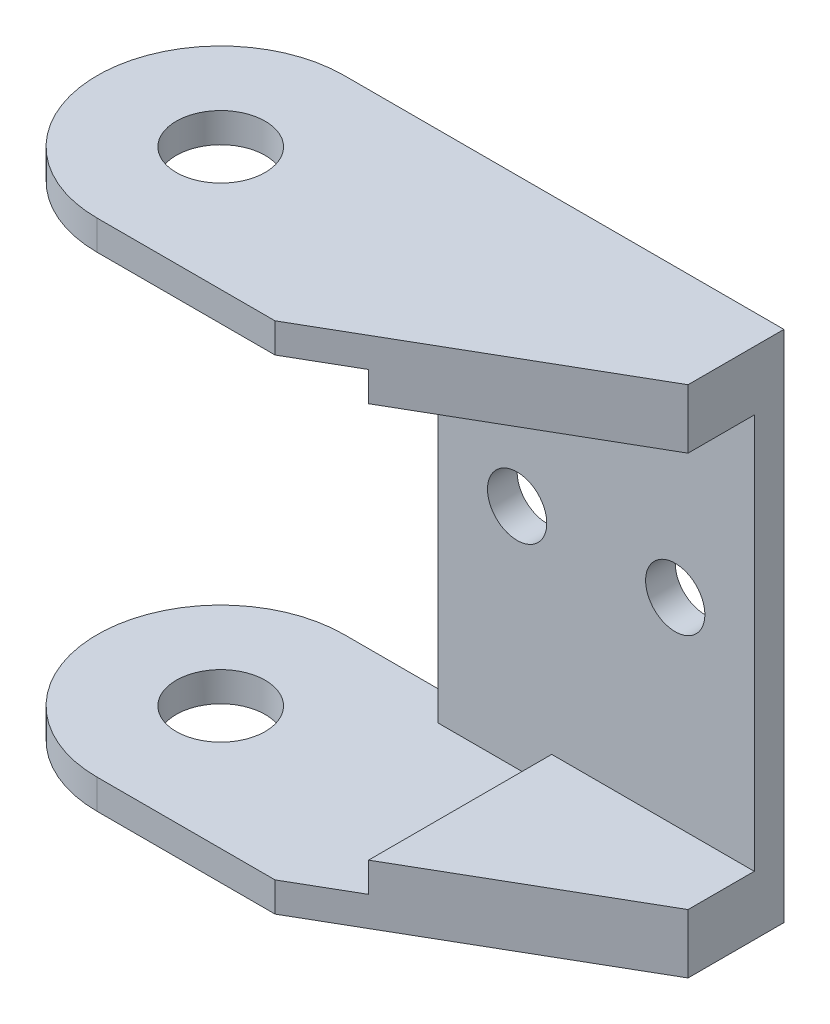
ISO-10303-21;
HEADER;
FILE_DESCRIPTION(('STEP AP214'),'2;1');
FILE_NAME('part.step','',(''),(''),'','','');
FILE_SCHEMA(('AUTOMOTIVE_DESIGN { 1 0 10303 214 1 1 1 1 }'));
ENDSEC;
DATA;
#1=APPLICATION_CONTEXT('core data for automotive mechanical design processes');
#2=APPLICATION_PROTOCOL_DEFINITION('international standard','automotive_design',2000,#1);
#3=PRODUCT_CONTEXT('',#1,'mechanical');
#4=PRODUCT('Part','Part','',(#3));
#5=PRODUCT_RELATED_PRODUCT_CATEGORY('part','',(#4));
#6=PRODUCT_DEFINITION_FORMATION('','',#4);
#7=PRODUCT_DEFINITION_CONTEXT('part definition',#1,'design');
#8=PRODUCT_DEFINITION('design','',#6,#7);
#9=PRODUCT_DEFINITION_SHAPE('','',#8);
#10=(LENGTH_UNIT() NAMED_UNIT(*) SI_UNIT(.MILLI.,.METRE.));
#11=(NAMED_UNIT(*) PLANE_ANGLE_UNIT() SI_UNIT($,.RADIAN.));
#12=(NAMED_UNIT(*) SI_UNIT($,.STERADIAN.) SOLID_ANGLE_UNIT());
#13=UNCERTAINTY_MEASURE_WITH_UNIT(LENGTH_MEASURE(1.E-05),#10,'distance_accuracy_value','');
#14=(GEOMETRIC_REPRESENTATION_CONTEXT(3) GLOBAL_UNCERTAINTY_ASSIGNED_CONTEXT((#13)) GLOBAL_UNIT_ASSIGNED_CONTEXT((#10,
#11,#12)) REPRESENTATION_CONTEXT('',''));
#15=CARTESIAN_POINT('',(0.,0.,0.));
#16=DIRECTION('',(0.,0.,1.));
#17=DIRECTION('',(1.,0.,0.));
#18=AXIS2_PLACEMENT_3D('',#15,#16,#17);
#19=CARTESIAN_POINT('',(0.,0.,0.));
#20=DIRECTION('',(0.,0.,-1.));
#21=DIRECTION('',(-1.,0.,0.));
#22=AXIS2_PLACEMENT_3D('',#19,#20,#21);
#23=PLANE('',#22);
#24=CARTESIAN_POINT('',(3.99999999999995,0.,0.));
#25=DIRECTION('',(0.,0.,-1.));
#26=DIRECTION('',(-1.,0.,0.));
#27=AXIS2_PLACEMENT_3D('',#24,#25,#26);
#28=CIRCLE('',#27,1.49999999999999);
#29=CARTESIAN_POINT('',(2.49999999999996,0.,0.));
#30=VERTEX_POINT('',#29);
#31=EDGE_CURVE('E282',#30,#30,#28,.T.);
#32=ORIENTED_EDGE('',*,*,#31,.F.);
#33=EDGE_LOOP('',(#32));
#34=FACE_BOUND('',#33,.T.);
#35=CARTESIAN_POINT('',(-4.00000000000006,0.,0.));
#36=DIRECTION('',(0.,0.,-1.));
#37=DIRECTION('',(-1.,0.,0.));
#38=AXIS2_PLACEMENT_3D('',#35,#36,#37);
#39=CIRCLE('',#38,1.49999999999999);
#40=CARTESIAN_POINT('',(-5.50000000000004,0.,0.));
#41=VERTEX_POINT('',#40);
#42=EDGE_CURVE('E272',#41,#41,#39,.T.);
#43=ORIENTED_EDGE('',*,*,#42,.F.);
#44=EDGE_LOOP('',(#43));
#45=FACE_BOUND('',#44,.T.);
#46=DIRECTION('',(-1.,0.,0.));
#47=VECTOR('',#46,1.);
#48=CARTESIAN_POINT('',(-7.99999999999995,-11.5,0.));
#49=LINE('',#48,#47);
#50=CARTESIAN_POINT('',(-7.99999999999995,-11.5,0.));
#51=VERTEX_POINT('',#50);
#52=CARTESIAN_POINT('',(-14.25,-11.5,0.));
#53=VERTEX_POINT('',#52);
#54=EDGE_CURVE('E162',#51,#53,#49,.T.);
#55=ORIENTED_EDGE('',*,*,#54,.F.);
#56=DIRECTION('',(0.,1.,0.));
#57=VECTOR('',#56,1.);
#58=CARTESIAN_POINT('',(-7.99999999999995,-9.99999999999997,0.));
#59=LINE('',#58,#57);
#60=CARTESIAN_POINT('',(-7.99999999999995,11.5,0.));
#61=VERTEX_POINT('',#60);
#62=EDGE_CURVE('E147',#51,#61,#59,.T.);
#63=ORIENTED_EDGE('',*,*,#62,.T.);
#64=DIRECTION('',(-1.,0.,0.));
#65=VECTOR('',#64,1.);
#66=CARTESIAN_POINT('',(-7.99999999999995,11.5,0.));
#67=LINE('',#66,#65);
#68=CARTESIAN_POINT('',(-14.25,11.5,0.));
#69=VERTEX_POINT('',#68);
#70=EDGE_CURVE('E199',#61,#69,#67,.T.);
#71=ORIENTED_EDGE('',*,*,#70,.T.);
#72=DIRECTION('',(0.,-1.,0.));
#73=VECTOR('',#72,1.);
#74=CARTESIAN_POINT('',(-14.25,13.,0.));
#75=LINE('',#74,#73);
#76=CARTESIAN_POINT('',(-14.25,13.,0.));
#77=VERTEX_POINT('',#76);
#78=EDGE_CURVE('E245',#77,#69,#75,.T.);
#79=ORIENTED_EDGE('',*,*,#78,.F.);
#80=DIRECTION('',(-1.,0.,0.));
#81=VECTOR('',#80,1.);
#82=CARTESIAN_POINT('',(-14.25,13.,0.));
#83=LINE('',#82,#81);
#84=CARTESIAN_POINT('',(7.99999999999995,13.,0.));
#85=VERTEX_POINT('',#84);
#86=EDGE_CURVE('E243',#85,#77,#83,.T.);
#87=ORIENTED_EDGE('',*,*,#86,.F.);
#88=DIRECTION('',(0.,-1.,0.));
#89=VECTOR('',#88,1.);
#90=CARTESIAN_POINT('',(7.99999999999995,9.99999999999998,0.));
#91=LINE('',#90,#89);
#92=CARTESIAN_POINT('',(7.99999999999995,-13.,0.));
#93=VERTEX_POINT('',#92);
#94=EDGE_CURVE('E157',#85,#93,#91,.T.);
#95=ORIENTED_EDGE('',*,*,#94,.T.);
#96=DIRECTION('',(-1.,0.,0.));
#97=VECTOR('',#96,1.);
#98=CARTESIAN_POINT('',(-14.25,-13.,0.));
#99=LINE('',#98,#97);
#100=CARTESIAN_POINT('',(-14.25,-13.,0.));
#101=VERTEX_POINT('',#100);
#102=EDGE_CURVE('E211',#93,#101,#99,.T.);
#103=ORIENTED_EDGE('',*,*,#102,.T.);
#104=DIRECTION('',(0.,1.,0.));
#105=VECTOR('',#104,1.);
#106=CARTESIAN_POINT('',(-14.25,-13.,0.));
#107=LINE('',#106,#105);
#108=EDGE_CURVE('E169',#101,#53,#107,.T.);
#109=ORIENTED_EDGE('',*,*,#108,.T.);
#110=EDGE_LOOP('',(#55,#63,#71,#79,#87,#95,#103,#109));
#111=FACE_BOUND('',#110,.T.);
#112=ADVANCED_FACE('F32',(#34,#45,#111),#23,.T.);
#113=CARTESIAN_POINT('',(-14.25,9.99999999999998,6.25));
#114=DIRECTION('',(0.,-1.,0.));
#115=DIRECTION('',(0.,0.,-1.));
#116=AXIS2_PLACEMENT_3D('',#113,#114,#115);
#117=PLANE('',#116);
#118=DIRECTION('',(0.86602540378444,0.,-0.499999999999998));
#119=VECTOR('',#118,1.);
#120=CARTESIAN_POINT('',(7.99999999999995,9.99999999999998,4.85010893323751));
#121=LINE('',#120,#119);
#122=CARTESIAN_POINT('',(-2.25000000000003,9.99999999999998,10.7679491924311));
#123=VERTEX_POINT('',#122);
#124=CARTESIAN_POINT('',(7.99999999999995,9.99999999999998,4.85010893323751));
#125=VERTEX_POINT('',#124);
#126=EDGE_CURVE('E246',#123,#125,#121,.T.);
#127=ORIENTED_EDGE('',*,*,#126,.F.);
#128=DIRECTION('',(0.,0.,-1.));
#129=VECTOR('',#128,1.);
#130=CARTESIAN_POINT('',(-2.25000000000003,9.99999999999998,12.5));
#131=LINE('',#130,#129);
#132=CARTESIAN_POINT('',(-2.25000000000003,9.99999999999998,1.5));
#133=VERTEX_POINT('',#132);
#134=EDGE_CURVE('E190',#123,#133,#131,.T.);
#135=ORIENTED_EDGE('',*,*,#134,.T.);
#136=DIRECTION('',(1.,0.,0.));
#137=VECTOR('',#136,1.);
#138=CARTESIAN_POINT('',(-7.99999999999995,9.99999999999998,1.5));
#139=LINE('',#138,#137);
#140=CARTESIAN_POINT('',(7.99999999999995,9.99999999999998,1.5));
#141=VERTEX_POINT('',#140);
#142=EDGE_CURVE('E258',#133,#141,#139,.T.);
#143=ORIENTED_EDGE('',*,*,#142,.T.);
#144=DIRECTION('',(0.,0.,-1.));
#145=VECTOR('',#144,1.);
#146=CARTESIAN_POINT('',(7.99999999999995,9.99999999999998,0.));
#147=LINE('',#146,#145);
#148=EDGE_CURVE('E236',#125,#141,#147,.T.);
#149=ORIENTED_EDGE('',*,*,#148,.F.);
#150=EDGE_LOOP('',(#127,#135,#143,#149));
#151=FACE_BOUND('',#150,.T.);
#152=ADVANCED_FACE('F309',(#151),#117,.T.);
#153=CARTESIAN_POINT('',(7.99999999999995,13.,4.85010893323751));
#154=DIRECTION('',(-0.499999999999998,0.,-0.86602540378444));
#155=DIRECTION('',(-0.86602540378444,0.,0.499999999999998));
#156=AXIS2_PLACEMENT_3D('',#153,#154,#155);
#157=PLANE('',#156);
#158=DIRECTION('',(0.,1.,0.));
#159=VECTOR('',#158,1.);
#160=CARTESIAN_POINT('',(-2.25000000000003,13.,10.7679491924311));
#161=LINE('',#160,#159);
#162=CARTESIAN_POINT('',(-2.25000000000003,11.5,10.7679491924311));
#163=VERTEX_POINT('',#162);
#164=EDGE_CURVE('E41',#123,#163,#161,.T.);
#165=ORIENTED_EDGE('',*,*,#164,.F.);
#166=ORIENTED_EDGE('',*,*,#126,.T.);
#167=DIRECTION('',(0.,-1.,0.));
#168=VECTOR('',#167,1.);
#169=CARTESIAN_POINT('',(7.99999999999995,13.,4.85010893323751));
#170=LINE('',#169,#168);
#171=CARTESIAN_POINT('',(7.99999999999995,13.,4.85010893323751));
#172=VERTEX_POINT('',#171);
#173=EDGE_CURVE('E345',#172,#125,#170,.T.);
#174=ORIENTED_EDGE('',*,*,#173,.F.);
#175=DIRECTION('',(0.86602540378444,0.,-0.499999999999998));
#176=VECTOR('',#175,1.);
#177=CARTESIAN_POINT('',(7.99999999999995,13.,4.85010893323751));
#178=LINE('',#177,#176);
#179=CARTESIAN_POINT('',(-5.25000000000003,13.,12.5));
#180=VERTEX_POINT('',#179);
#181=EDGE_CURVE('E238',#180,#172,#178,.T.);
#182=ORIENTED_EDGE('',*,*,#181,.F.);
#183=DIRECTION('',(0.,-1.,0.));
#184=VECTOR('',#183,1.);
#185=CARTESIAN_POINT('',(-5.25000000000003,13.,12.5));
#186=LINE('',#185,#184);
#187=CARTESIAN_POINT('',(-5.25000000000004,11.5,12.5));
#188=VERTEX_POINT('',#187);
#189=EDGE_CURVE('E351',#180,#188,#186,.T.);
#190=ORIENTED_EDGE('',*,*,#189,.T.);
#191=DIRECTION('',(0.86602540378444,0.,-0.499999999999998));
#192=VECTOR('',#191,1.);
#193=CARTESIAN_POINT('',(7.99999999999995,11.5,4.85010893323751));
#194=LINE('',#193,#192);
#195=EDGE_CURVE('E367',#188,#163,#194,.T.);
#196=ORIENTED_EDGE('',*,*,#195,.T.);
#197=EDGE_LOOP('',(#165,#166,#174,#182,#190,#196));
#198=FACE_BOUND('',#197,.T.);
#199=ADVANCED_FACE('F315',(#198),#157,.F.);
#200=CARTESIAN_POINT('',(-7.99999999999995,-9.99999999999997,1.5));
#201=DIRECTION('',(-1.,0.,0.));
#202=DIRECTION('',(0.,0.,1.));
#203=AXIS2_PLACEMENT_3D('',#200,#201,#202);
#204=PLANE('',#203);
#205=ORIENTED_EDGE('',*,*,#62,.F.);
#206=DIRECTION('',(0.,0.,-1.));
#207=VECTOR('',#206,1.);
#208=CARTESIAN_POINT('',(-7.99999999999995,-11.5,1.5));
#209=LINE('',#208,#207);
#210=CARTESIAN_POINT('',(-7.99999999999995,-11.5,1.5));
#211=VERTEX_POINT('',#210);
#212=EDGE_CURVE('E149',#211,#51,#209,.T.);
#213=ORIENTED_EDGE('',*,*,#212,.F.);
#214=DIRECTION('',(0.,1.,0.));
#215=VECTOR('',#214,1.);
#216=CARTESIAN_POINT('',(-7.99999999999995,-9.99999999999997,1.5));
#217=LINE('',#216,#215);
#218=CARTESIAN_POINT('',(-7.99999999999995,11.5,1.5));
#219=VERTEX_POINT('',#218);
#220=EDGE_CURVE('E256',#211,#219,#217,.T.);
#221=ORIENTED_EDGE('',*,*,#220,.T.);
#222=DIRECTION('',(0.,0.,-1.));
#223=VECTOR('',#222,1.);
#224=CARTESIAN_POINT('',(-7.99999999999995,11.5,1.5));
#225=LINE('',#224,#223);
#226=EDGE_CURVE('E152',#219,#61,#225,.T.);
#227=ORIENTED_EDGE('',*,*,#226,.T.);
#228=EDGE_LOOP('',(#205,#213,#221,#227));
#229=FACE_BOUND('',#228,.T.);
#230=ADVANCED_FACE('F34',(#229),#204,.T.);
#231=CARTESIAN_POINT('',(7.99999999999995,9.99999999999998,1.5));
#232=DIRECTION('',(1.,0.,0.));
#233=DIRECTION('',(0.,0.,-1.));
#234=AXIS2_PLACEMENT_3D('',#231,#232,#233);
#235=PLANE('',#234);
#236=ORIENTED_EDGE('',*,*,#94,.F.);
#237=DIRECTION('',(0.,0.,-1.));
#238=VECTOR('',#237,1.);
#239=CARTESIAN_POINT('',(7.99999999999995,13.,0.));
#240=LINE('',#239,#238);
#241=EDGE_CURVE('E240',#172,#85,#240,.T.);
#242=ORIENTED_EDGE('',*,*,#241,.F.);
#243=ORIENTED_EDGE('',*,*,#173,.T.);
#244=ORIENTED_EDGE('',*,*,#148,.T.);
#245=DIRECTION('',(0.,-1.,0.));
#246=VECTOR('',#245,1.);
#247=CARTESIAN_POINT('',(7.99999999999995,9.99999999999998,1.5));
#248=LINE('',#247,#246);
#249=CARTESIAN_POINT('',(7.99999999999995,-9.99999999999998,1.5));
#250=VERTEX_POINT('',#249);
#251=EDGE_CURVE('E264',#141,#250,#248,.T.);
#252=ORIENTED_EDGE('',*,*,#251,.T.);
#253=DIRECTION('',(0.,0.,-1.));
#254=VECTOR('',#253,1.);
#255=CARTESIAN_POINT('',(7.99999999999995,-9.99999999999998,0.));
#256=LINE('',#255,#254);
#257=CARTESIAN_POINT('',(7.99999999999995,-9.99999999999998,4.85010893323751));
#258=VERTEX_POINT('',#257);
#259=EDGE_CURVE('E207',#258,#250,#256,.T.);
#260=ORIENTED_EDGE('',*,*,#259,.F.);
#261=DIRECTION('',(0.,1.,0.));
#262=VECTOR('',#261,1.);
#263=CARTESIAN_POINT('',(7.99999999999995,-13.,4.85010893323751));
#264=LINE('',#263,#262);
#265=CARTESIAN_POINT('',(7.99999999999995,-13.,4.85010893323751));
#266=VERTEX_POINT('',#265);
#267=EDGE_CURVE('E579',#266,#258,#264,.T.);
#268=ORIENTED_EDGE('',*,*,#267,.F.);
#269=DIRECTION('',(0.,0.,-1.));
#270=VECTOR('',#269,1.);
#271=CARTESIAN_POINT('',(7.99999999999995,-13.,0.));
#272=LINE('',#271,#270);
#273=EDGE_CURVE('E214',#266,#93,#272,.T.);
#274=ORIENTED_EDGE('',*,*,#273,.T.);
#275=EDGE_LOOP('',(#236,#242,#243,#244,#252,#260,#268,#274));
#276=FACE_BOUND('',#275,.T.);
#277=ADVANCED_FACE('F323',(#276),#235,.T.);
#278=CARTESIAN_POINT('',(0.,0.,1.5));
#279=DIRECTION('',(0.,0.,-1.));
#280=DIRECTION('',(-1.,0.,0.));
#281=AXIS2_PLACEMENT_3D('',#278,#279,#280);
#282=PLANE('',#281);
#283=CARTESIAN_POINT('',(3.99999999999995,0.,1.5));
#284=DIRECTION('',(0.,0.,-1.));
#285=DIRECTION('',(-1.,0.,0.));
#286=AXIS2_PLACEMENT_3D('',#283,#284,#285);
#287=CIRCLE('',#286,1.49999999999999);
#288=CARTESIAN_POINT('',(2.49999999999996,0.,1.5));
#289=VERTEX_POINT('',#288);
#290=EDGE_CURVE('E36',#289,#289,#287,.T.);
#291=ORIENTED_EDGE('',*,*,#290,.T.);
#292=EDGE_LOOP('',(#291));
#293=FACE_BOUND('',#292,.T.);
#294=CARTESIAN_POINT('',(-4.00000000000006,0.,1.5));
#295=DIRECTION('',(0.,0.,-1.));
#296=DIRECTION('',(-1.,0.,0.));
#297=AXIS2_PLACEMENT_3D('',#294,#295,#296);
#298=CIRCLE('',#297,1.49999999999999);
#299=CARTESIAN_POINT('',(-5.50000000000004,0.,1.5));
#300=VERTEX_POINT('',#299);
#301=EDGE_CURVE('E269',#300,#300,#298,.T.);
#302=ORIENTED_EDGE('',*,*,#301,.T.);
#303=EDGE_LOOP('',(#302));
#304=FACE_BOUND('',#303,.T.);
#305=ORIENTED_EDGE('',*,*,#220,.F.);
#306=DIRECTION('',(-1.,0.,0.));
#307=VECTOR('',#306,1.);
#308=CARTESIAN_POINT('',(-2.25000000000003,-11.5,1.5));
#309=LINE('',#308,#307);
#310=CARTESIAN_POINT('',(-2.25000000000003,-11.5,1.5));
#311=VERTEX_POINT('',#310);
#312=EDGE_CURVE('E165',#311,#211,#309,.T.);
#313=ORIENTED_EDGE('',*,*,#312,.F.);
#314=DIRECTION('',(0.,1.,0.));
#315=VECTOR('',#314,1.);
#316=CARTESIAN_POINT('',(-2.25000000000003,-11.5,1.5));
#317=LINE('',#316,#315);
#318=CARTESIAN_POINT('',(-2.25000000000003,-9.99999999999998,1.5));
#319=VERTEX_POINT('',#318);
#320=EDGE_CURVE('E182',#311,#319,#317,.T.);
#321=ORIENTED_EDGE('',*,*,#320,.T.);
#322=DIRECTION('',(-1.,0.,0.));
#323=VECTOR('',#322,1.);
#324=CARTESIAN_POINT('',(7.99999999999995,-9.99999999999998,1.5));
#325=LINE('',#324,#323);
#326=EDGE_CURVE('E365',#250,#319,#325,.T.);
#327=ORIENTED_EDGE('',*,*,#326,.F.);
#328=ORIENTED_EDGE('',*,*,#251,.F.);
#329=ORIENTED_EDGE('',*,*,#142,.F.);
#330=DIRECTION('',(0.,-1.,0.));
#331=VECTOR('',#330,1.);
#332=CARTESIAN_POINT('',(-2.25000000000003,11.5,1.5));
#333=LINE('',#332,#331);
#334=CARTESIAN_POINT('',(-2.25000000000003,11.5,1.5));
#335=VERTEX_POINT('',#334);
#336=EDGE_CURVE('E201',#335,#133,#333,.T.);
#337=ORIENTED_EDGE('',*,*,#336,.F.);
#338=DIRECTION('',(-1.,0.,0.));
#339=VECTOR('',#338,1.);
#340=CARTESIAN_POINT('',(-2.25000000000003,11.5,1.5));
#341=LINE('',#340,#339);
#342=EDGE_CURVE('E195',#335,#219,#341,.T.);
#343=ORIENTED_EDGE('',*,*,#342,.T.);
#344=EDGE_LOOP('',(#305,#313,#321,#327,#328,#329,#337,#343));
#345=FACE_BOUND('',#344,.T.);
#346=ADVANCED_FACE('F321',(#293,#304,#345),#282,.F.);
#347=CARTESIAN_POINT('',(-14.25,13.,6.25));
#348=DIRECTION('',(0.,-1.,0.));
#349=DIRECTION('',(0.,0.,-1.));
#350=AXIS2_PLACEMENT_3D('',#347,#348,#349);
#351=CYLINDRICAL_SURFACE('',#350,6.25);
#352=ORIENTED_EDGE('',*,*,#78,.T.);
#353=CARTESIAN_POINT('',(-14.25,11.5,6.25));
#354=DIRECTION('',(0.,1.,0.));
#355=DIRECTION('',(0.,0.,1.));
#356=AXIS2_PLACEMENT_3D('',#353,#354,#355);
#357=CIRCLE('',#356,6.25);
#358=CARTESIAN_POINT('',(-14.25,11.5,12.5));
#359=VERTEX_POINT('',#358);
#360=EDGE_CURVE('E205',#69,#359,#357,.T.);
#361=ORIENTED_EDGE('',*,*,#360,.T.);
#362=DIRECTION('',(0.,-1.,0.));
#363=VECTOR('',#362,1.);
#364=CARTESIAN_POINT('',(-14.25,13.,12.5));
#365=LINE('',#364,#363);
#366=CARTESIAN_POINT('',(-14.25,13.,12.5));
#367=VERTEX_POINT('',#366);
#368=EDGE_CURVE('E158',#367,#359,#365,.T.);
#369=ORIENTED_EDGE('',*,*,#368,.F.);
#370=CARTESIAN_POINT('',(-14.25,13.,6.25));
#371=DIRECTION('',(0.,1.,0.));
#372=DIRECTION('',(0.,0.,-1.));
#373=AXIS2_PLACEMENT_3D('',#370,#371,#372);
#374=CIRCLE('',#373,6.25);
#375=EDGE_CURVE('E232',#77,#367,#374,.T.);
#376=ORIENTED_EDGE('',*,*,#375,.F.);
#377=EDGE_LOOP('',(#352,#361,#369,#376));
#378=FACE_BOUND('',#377,.T.);
#379=ADVANCED_FACE('F330',(#378),#351,.T.);
#380=CARTESIAN_POINT('',(-5.25000000000003,13.,12.5));
#381=DIRECTION('',(0.,0.,-1.));
#382=DIRECTION('',(-1.,0.,0.));
#383=AXIS2_PLACEMENT_3D('',#380,#381,#382);
#384=PLANE('',#383);
#385=ORIENTED_EDGE('',*,*,#368,.T.);
#386=DIRECTION('',(1.,0.,0.));
#387=VECTOR('',#386,1.);
#388=CARTESIAN_POINT('',(-20.5,11.5,12.5));
#389=LINE('',#388,#387);
#390=EDGE_CURVE('E191',#359,#188,#389,.T.);
#391=ORIENTED_EDGE('',*,*,#390,.T.);
#392=ORIENTED_EDGE('',*,*,#189,.F.);
#393=DIRECTION('',(1.,0.,0.));
#394=VECTOR('',#393,1.);
#395=CARTESIAN_POINT('',(-5.25000000000003,13.,12.5));
#396=LINE('',#395,#394);
#397=EDGE_CURVE('E235',#367,#180,#396,.T.);
#398=ORIENTED_EDGE('',*,*,#397,.F.);
#399=EDGE_LOOP('',(#385,#391,#392,#398));
#400=FACE_BOUND('',#399,.T.);
#401=ADVANCED_FACE('F352',(#400),#384,.F.);
#402=CARTESIAN_POINT('',(-14.25,13.,6.25));
#403=DIRECTION('',(0.,-1.,0.));
#404=DIRECTION('',(0.,0.,-1.));
#405=AXIS2_PLACEMENT_3D('',#402,#403,#404);
#406=PLANE('',#405);
#407=CARTESIAN_POINT('',(-14.25,13.,6.25));
#408=DIRECTION('',(0.,1.,0.));
#409=DIRECTION('',(0.,0.,1.));
#410=AXIS2_PLACEMENT_3D('',#407,#408,#409);
#411=CIRCLE('',#410,2.24999999999999);
#412=CARTESIAN_POINT('',(-14.25,13.,8.49999999999999));
#413=VERTEX_POINT('',#412);
#414=EDGE_CURVE('E271',#413,#413,#411,.T.);
#415=ORIENTED_EDGE('',*,*,#414,.F.);
#416=EDGE_LOOP('',(#415));
#417=FACE_BOUND('',#416,.T.);
#418=ORIENTED_EDGE('',*,*,#375,.T.);
#419=ORIENTED_EDGE('',*,*,#397,.T.);
#420=ORIENTED_EDGE('',*,*,#181,.T.);
#421=ORIENTED_EDGE('',*,*,#241,.T.);
#422=ORIENTED_EDGE('',*,*,#86,.T.);
#423=EDGE_LOOP('',(#418,#419,#420,#421,#422));
#424=FACE_BOUND('',#423,.T.);
#425=ADVANCED_FACE('F338',(#417,#424),#406,.F.);
#426=CARTESIAN_POINT('',(-14.25,-13.,6.25));
#427=DIRECTION('',(0.,1.,0.));
#428=DIRECTION('',(0.,0.,1.));
#429=AXIS2_PLACEMENT_3D('',#426,#427,#428);
#430=CYLINDRICAL_SURFACE('',#429,6.25);
#431=CARTESIAN_POINT('',(-14.25,-11.5,6.25));
#432=DIRECTION('',(0.,-1.,0.));
#433=DIRECTION('',(0.,0.,-1.));
#434=AXIS2_PLACEMENT_3D('',#431,#432,#433);
#435=CIRCLE('',#434,6.25);
#436=CARTESIAN_POINT('',(-14.25,-11.5,12.5));
#437=VERTEX_POINT('',#436);
#438=EDGE_CURVE('E188',#53,#437,#435,.F.);
#439=ORIENTED_EDGE('',*,*,#438,.F.);
#440=ORIENTED_EDGE('',*,*,#108,.F.);
#441=CARTESIAN_POINT('',(-14.25,-13.,6.25));
#442=DIRECTION('',(0.,1.,0.));
#443=DIRECTION('',(0.,0.,-1.));
#444=AXIS2_PLACEMENT_3D('',#441,#442,#443);
#445=CIRCLE('',#444,6.25);
#446=CARTESIAN_POINT('',(-14.25,-13.,12.5));
#447=VERTEX_POINT('',#446);
#448=EDGE_CURVE('E208',#101,#447,#445,.T.);
#449=ORIENTED_EDGE('',*,*,#448,.T.);
#450=DIRECTION('',(0.,1.,0.));
#451=VECTOR('',#450,1.);
#452=CARTESIAN_POINT('',(-14.25,-13.,12.5));
#453=LINE('',#452,#451);
#454=EDGE_CURVE('E223',#447,#437,#453,.T.);
#455=ORIENTED_EDGE('',*,*,#454,.T.);
#456=EDGE_LOOP('',(#439,#440,#449,#455));
#457=FACE_BOUND('',#456,.T.);
#458=ADVANCED_FACE('F398',(#457),#430,.T.);
#459=CARTESIAN_POINT('',(7.99999999999995,-13.,4.85010893323751));
#460=DIRECTION('',(0.499999999999998,0.,0.86602540378444));
#461=DIRECTION('',(0.86602540378444,0.,-0.499999999999998));
#462=AXIS2_PLACEMENT_3D('',#459,#460,#461);
#463=PLANE('',#462);
#464=DIRECTION('',(0.,1.,0.));
#465=VECTOR('',#464,1.);
#466=CARTESIAN_POINT('',(-2.25000000000003,-13.,10.7679491924311));
#467=LINE('',#466,#465);
#468=CARTESIAN_POINT('',(-2.25000000000003,-11.5,10.7679491924311));
#469=VERTEX_POINT('',#468);
#470=CARTESIAN_POINT('',(-2.25000000000003,-9.99999999999998,10.7679491924311));
#471=VERTEX_POINT('',#470);
#472=EDGE_CURVE('E48',#469,#471,#467,.T.);
#473=ORIENTED_EDGE('',*,*,#472,.F.);
#474=DIRECTION('',(0.86602540378444,0.,-0.499999999999998));
#475=VECTOR('',#474,1.);
#476=CARTESIAN_POINT('',(7.99999999999995,-11.5,4.85010893323751));
#477=LINE('',#476,#475);
#478=CARTESIAN_POINT('',(-5.25000000000003,-11.5,12.5));
#479=VERTEX_POINT('',#478);
#480=EDGE_CURVE('E186',#479,#469,#477,.T.);
#481=ORIENTED_EDGE('',*,*,#480,.F.);
#482=DIRECTION('',(0.,1.,0.));
#483=VECTOR('',#482,1.);
#484=CARTESIAN_POINT('',(-5.25000000000003,-13.,12.5));
#485=LINE('',#484,#483);
#486=CARTESIAN_POINT('',(-5.25000000000003,-13.,12.5));
#487=VERTEX_POINT('',#486);
#488=EDGE_CURVE('E576',#487,#479,#485,.T.);
#489=ORIENTED_EDGE('',*,*,#488,.F.);
#490=DIRECTION('',(0.86602540378444,0.,-0.499999999999998));
#491=VECTOR('',#490,1.);
#492=CARTESIAN_POINT('',(7.99999999999995,-13.,4.85010893323751));
#493=LINE('',#492,#491);
#494=EDGE_CURVE('E217',#487,#266,#493,.T.);
#495=ORIENTED_EDGE('',*,*,#494,.T.);
#496=ORIENTED_EDGE('',*,*,#267,.T.);
#497=DIRECTION('',(0.86602540378444,0.,-0.499999999999998));
#498=VECTOR('',#497,1.);
#499=CARTESIAN_POINT('',(7.99999999999995,-9.99999999999998,4.85010893323751));
#500=LINE('',#499,#498);
#501=EDGE_CURVE('E212',#471,#258,#500,.T.);
#502=ORIENTED_EDGE('',*,*,#501,.F.);
#503=EDGE_LOOP('',(#473,#481,#489,#495,#496,#502));
#504=FACE_BOUND('',#503,.T.);
#505=ADVANCED_FACE('F394',(#504),#463,.T.);
#506=CARTESIAN_POINT('',(-5.25000000000003,-13.,12.5));
#507=DIRECTION('',(0.,0.,1.));
#508=DIRECTION('',(1.,0.,0.));
#509=AXIS2_PLACEMENT_3D('',#506,#507,#508);
#510=PLANE('',#509);
#511=DIRECTION('',(1.,0.,0.));
#512=VECTOR('',#511,1.);
#513=CARTESIAN_POINT('',(-20.5,-11.5,12.5));
#514=LINE('',#513,#512);
#515=EDGE_CURVE('E180',#437,#479,#514,.T.);
#516=ORIENTED_EDGE('',*,*,#515,.F.);
#517=ORIENTED_EDGE('',*,*,#454,.F.);
#518=DIRECTION('',(1.,0.,0.));
#519=VECTOR('',#518,1.);
#520=CARTESIAN_POINT('',(-5.25000000000003,-13.,12.5));
#521=LINE('',#520,#519);
#522=EDGE_CURVE('E220',#447,#487,#521,.T.);
#523=ORIENTED_EDGE('',*,*,#522,.T.);
#524=ORIENTED_EDGE('',*,*,#488,.T.);
#525=EDGE_LOOP('',(#516,#517,#523,#524));
#526=FACE_BOUND('',#525,.T.);
#527=ADVANCED_FACE('F388',(#526),#510,.T.);
#528=CARTESIAN_POINT('',(-14.25,-13.,6.25));
#529=DIRECTION('',(0.,1.,0.));
#530=DIRECTION('',(0.,0.,-1.));
#531=AXIS2_PLACEMENT_3D('',#528,#529,#530);
#532=PLANE('',#531);
#533=CARTESIAN_POINT('',(-14.25,-13.,6.25));
#534=DIRECTION('',(0.,1.,0.));
#535=DIRECTION('',(0.,0.,1.));
#536=AXIS2_PLACEMENT_3D('',#533,#534,#535);
#537=CIRCLE('',#536,2.25);
#538=CARTESIAN_POINT('',(-14.25,-13.,8.5));
#539=VERTEX_POINT('',#538);
#540=EDGE_CURVE('E268',#539,#539,#537,.T.);
#541=ORIENTED_EDGE('',*,*,#540,.T.);
#542=EDGE_LOOP('',(#541));
#543=FACE_BOUND('',#542,.T.);
#544=ORIENTED_EDGE('',*,*,#448,.F.);
#545=ORIENTED_EDGE('',*,*,#102,.F.);
#546=ORIENTED_EDGE('',*,*,#273,.F.);
#547=ORIENTED_EDGE('',*,*,#494,.F.);
#548=ORIENTED_EDGE('',*,*,#522,.F.);
#549=EDGE_LOOP('',(#544,#545,#546,#547,#548));
#550=FACE_BOUND('',#549,.T.);
#551=ADVANCED_FACE('F287',(#543,#550),#532,.F.);
#552=CARTESIAN_POINT('',(-14.25,-9.99999999999998,6.25));
#553=DIRECTION('',(0.,1.,0.));
#554=DIRECTION('',(0.,0.,-1.));
#555=AXIS2_PLACEMENT_3D('',#552,#553,#554);
#556=PLANE('',#555);
#557=DIRECTION('',(0.,0.,-1.));
#558=VECTOR('',#557,1.);
#559=CARTESIAN_POINT('',(-2.25000000000003,-9.99999999999998,6.25));
#560=LINE('',#559,#558);
#561=EDGE_CURVE('E11',#471,#319,#560,.T.);
#562=ORIENTED_EDGE('',*,*,#561,.F.);
#563=ORIENTED_EDGE('',*,*,#501,.T.);
#564=ORIENTED_EDGE('',*,*,#259,.T.);
#565=ORIENTED_EDGE('',*,*,#326,.T.);
#566=EDGE_LOOP('',(#562,#563,#564,#565));
#567=FACE_BOUND('',#566,.T.);
#568=ADVANCED_FACE('F383',(#567),#556,.T.);
#569=CARTESIAN_POINT('',(-2.25000000000003,11.5,12.5));
#570=DIRECTION('',(-1.,0.,0.));
#571=DIRECTION('',(0.,0.,1.));
#572=AXIS2_PLACEMENT_3D('',#569,#570,#571);
#573=PLANE('',#572);
#574=ORIENTED_EDGE('',*,*,#164,.T.);
#575=DIRECTION('',(0.,0.,-1.));
#576=VECTOR('',#575,1.);
#577=CARTESIAN_POINT('',(-2.25000000000003,11.5,12.5));
#578=LINE('',#577,#576);
#579=EDGE_CURVE('E56',#163,#335,#578,.T.);
#580=ORIENTED_EDGE('',*,*,#579,.T.);
#581=ORIENTED_EDGE('',*,*,#336,.T.);
#582=ORIENTED_EDGE('',*,*,#134,.F.);
#583=EDGE_LOOP('',(#574,#580,#581,#582));
#584=FACE_BOUND('',#583,.T.);
#585=ADVANCED_FACE('F376',(#584),#573,.T.);
#586=CARTESIAN_POINT('',(0.,11.5,0.));
#587=DIRECTION('',(0.,1.,0.));
#588=DIRECTION('',(0.,0.,1.));
#589=AXIS2_PLACEMENT_3D('',#586,#587,#588);
#590=PLANE('',#589);
#591=CARTESIAN_POINT('',(-14.25,11.5,6.25));
#592=DIRECTION('',(0.,1.,0.));
#593=DIRECTION('',(0.,0.,1.));
#594=AXIS2_PLACEMENT_3D('',#591,#592,#593);
#595=CIRCLE('',#594,2.24999999999999);
#596=CARTESIAN_POINT('',(-14.25,11.5,8.5));
#597=VERTEX_POINT('',#596);
#598=EDGE_CURVE('E173',#597,#597,#595,.T.);
#599=ORIENTED_EDGE('',*,*,#598,.T.);
#600=EDGE_LOOP('',(#599));
#601=FACE_BOUND('',#600,.T.);
#602=ORIENTED_EDGE('',*,*,#70,.F.);
#603=ORIENTED_EDGE('',*,*,#226,.F.);
#604=ORIENTED_EDGE('',*,*,#342,.F.);
#605=ORIENTED_EDGE('',*,*,#579,.F.);
#606=ORIENTED_EDGE('',*,*,#195,.F.);
#607=ORIENTED_EDGE('',*,*,#390,.F.);
#608=ORIENTED_EDGE('',*,*,#360,.F.);
#609=EDGE_LOOP('',(#602,#603,#604,#605,#606,#607,#608));
#610=FACE_BOUND('',#609,.T.);
#611=ADVANCED_FACE('F306',(#601,#610),#590,.F.);
#612=CARTESIAN_POINT('',(-2.25000000000003,-11.5,12.5));
#613=DIRECTION('',(1.,0.,0.));
#614=DIRECTION('',(0.,0.,-1.));
#615=AXIS2_PLACEMENT_3D('',#612,#613,#614);
#616=PLANE('',#615);
#617=ORIENTED_EDGE('',*,*,#472,.T.);
#618=ORIENTED_EDGE('',*,*,#561,.T.);
#619=ORIENTED_EDGE('',*,*,#320,.F.);
#620=DIRECTION('',(0.,0.,-1.));
#621=VECTOR('',#620,1.);
#622=CARTESIAN_POINT('',(-2.25000000000003,-11.5,12.5));
#623=LINE('',#622,#621);
#624=EDGE_CURVE('E178',#469,#311,#623,.T.);
#625=ORIENTED_EDGE('',*,*,#624,.F.);
#626=EDGE_LOOP('',(#617,#618,#619,#625));
#627=FACE_BOUND('',#626,.T.);
#628=ADVANCED_FACE('F299',(#627),#616,.F.);
#629=CARTESIAN_POINT('',(0.,-11.5,0.));
#630=DIRECTION('',(0.,-1.,0.));
#631=DIRECTION('',(0.,0.,1.));
#632=AXIS2_PLACEMENT_3D('',#629,#630,#631);
#633=PLANE('',#632);
#634=CARTESIAN_POINT('',(-14.25,-11.5,6.25));
#635=DIRECTION('',(0.,-1.,0.));
#636=DIRECTION('',(0.,0.,-1.));
#637=AXIS2_PLACEMENT_3D('',#634,#635,#636);
#638=CIRCLE('',#637,2.24999999999999);
#639=CARTESIAN_POINT('',(-14.25,-11.5,4.00000000000001));
#640=VERTEX_POINT('',#639);
#641=EDGE_CURVE('E170',#640,#640,#638,.T.);
#642=ORIENTED_EDGE('',*,*,#641,.T.);
#643=EDGE_LOOP('',(#642));
#644=FACE_BOUND('',#643,.T.);
#645=ORIENTED_EDGE('',*,*,#438,.T.);
#646=ORIENTED_EDGE('',*,*,#515,.T.);
#647=ORIENTED_EDGE('',*,*,#480,.T.);
#648=ORIENTED_EDGE('',*,*,#624,.T.);
#649=ORIENTED_EDGE('',*,*,#312,.T.);
#650=ORIENTED_EDGE('',*,*,#212,.T.);
#651=ORIENTED_EDGE('',*,*,#54,.T.);
#652=EDGE_LOOP('',(#645,#646,#647,#648,#649,#650,#651));
#653=FACE_BOUND('',#652,.T.);
#654=ADVANCED_FACE('F161',(#644,#653),#633,.F.);
#655=CARTESIAN_POINT('',(-14.25,13.,6.25));
#656=DIRECTION('',(0.,1.,0.));
#657=DIRECTION('',(0.,0.,1.));
#658=AXIS2_PLACEMENT_3D('',#655,#656,#657);
#659=CYLINDRICAL_SURFACE('',#658,2.24999999999999);
#660=ORIENTED_EDGE('',*,*,#414,.T.);
#661=EDGE_LOOP('',(#660));
#662=FACE_BOUND('',#661,.T.);
#663=ORIENTED_EDGE('',*,*,#598,.F.);
#664=EDGE_LOOP('',(#663));
#665=FACE_BOUND('',#664,.T.);
#666=ADVANCED_FACE('F294',(#662,#665),#659,.F.);
#667=ORIENTED_EDGE('',*,*,#540,.F.);
#668=EDGE_LOOP('',(#667));
#669=FACE_BOUND('',#668,.T.);
#670=ORIENTED_EDGE('',*,*,#641,.F.);
#671=EDGE_LOOP('',(#670));
#672=FACE_BOUND('',#671,.T.);
#673=ADVANCED_FACE('F290',(#669,#672),#659,.F.);
#674=CARTESIAN_POINT('',(-4.00000000000006,0.,0.));
#675=DIRECTION('',(0.,0.,-1.));
#676=DIRECTION('',(-1.,0.,0.));
#677=AXIS2_PLACEMENT_3D('',#674,#675,#676);
#678=CYLINDRICAL_SURFACE('',#677,1.49999999999999);
#679=ORIENTED_EDGE('',*,*,#42,.T.);
#680=EDGE_LOOP('',(#679));
#681=FACE_BOUND('',#680,.T.);
#682=ORIENTED_EDGE('',*,*,#301,.F.);
#683=EDGE_LOOP('',(#682));
#684=FACE_BOUND('',#683,.T.);
#685=ADVANCED_FACE('F293',(#681,#684),#678,.F.);
#686=CARTESIAN_POINT('',(3.99999999999995,0.,0.));
#687=DIRECTION('',(0.,0.,-1.));
#688=DIRECTION('',(-1.,0.,0.));
#689=AXIS2_PLACEMENT_3D('',#686,#687,#688);
#690=CYLINDRICAL_SURFACE('',#689,1.49999999999999);
#691=ORIENTED_EDGE('',*,*,#31,.T.);
#692=EDGE_LOOP('',(#691));
#693=FACE_BOUND('',#692,.T.);
#694=ORIENTED_EDGE('',*,*,#290,.F.);
#695=EDGE_LOOP('',(#694));
#696=FACE_BOUND('',#695,.T.);
#697=ADVANCED_FACE('F530',(#693,#696),#690,.F.);
#698=CLOSED_SHELL('',(#112,#152,#199,#230,#277,#346,#379,#401,#425,#458,#505,#527,#551,#568,
#585,#611,#628,#654,#666,#673,#685,#697));
#699=MANIFOLD_SOLID_BREP('B2',#698);
#700=ADVANCED_BREP_SHAPE_REPRESENTATION('',(#18,#699),#14);
#701=SHAPE_DEFINITION_REPRESENTATION(#9,#700);
ENDSEC;
END-ISO-10303-21;
